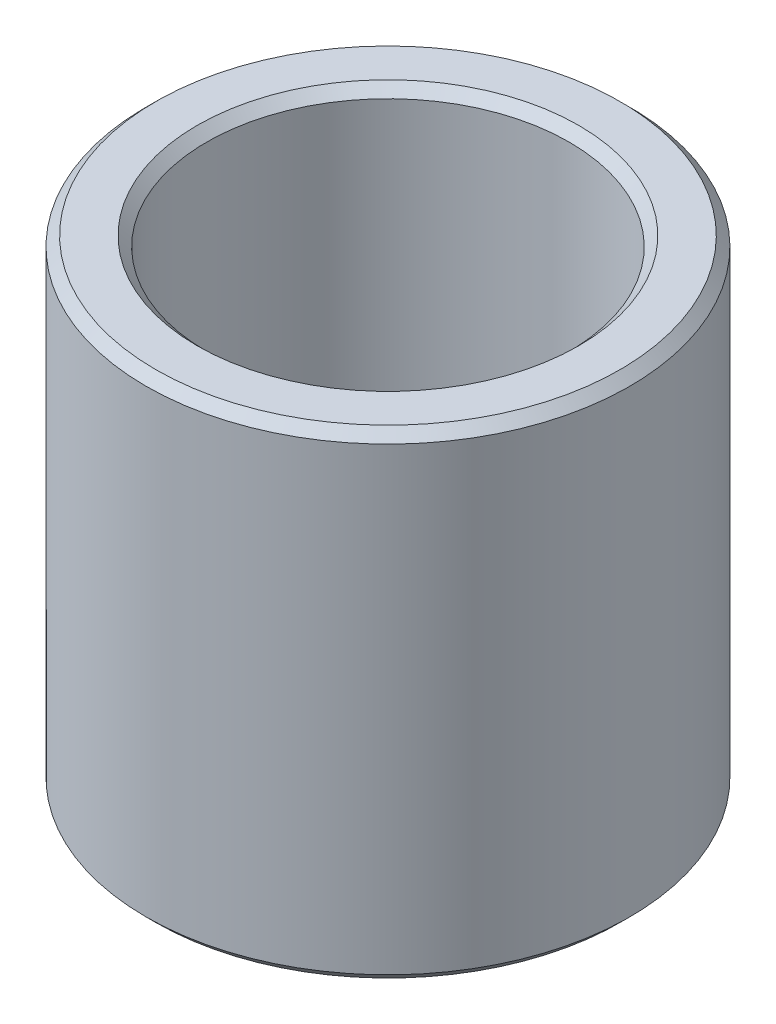
ISO-10303-21;
HEADER;
FILE_DESCRIPTION(('STEP AP214'),'2;1');
FILE_NAME('part.step','',(''),(''),'','','');
FILE_SCHEMA(('AUTOMOTIVE_DESIGN { 1 0 10303 214 1 1 1 1 }'));
ENDSEC;
DATA;
#1=APPLICATION_CONTEXT('core data for automotive mechanical design processes');
#2=APPLICATION_PROTOCOL_DEFINITION('international standard','automotive_design',2000,#1);
#3=PRODUCT_CONTEXT('',#1,'mechanical');
#4=PRODUCT('Part','Part','',(#3));
#5=PRODUCT_RELATED_PRODUCT_CATEGORY('part','',(#4));
#6=PRODUCT_DEFINITION_FORMATION('','',#4);
#7=PRODUCT_DEFINITION_CONTEXT('part definition',#1,'design');
#8=PRODUCT_DEFINITION('design','',#6,#7);
#9=PRODUCT_DEFINITION_SHAPE('','',#8);
#10=(LENGTH_UNIT() NAMED_UNIT(*) SI_UNIT(.MILLI.,.METRE.));
#11=(NAMED_UNIT(*) PLANE_ANGLE_UNIT() SI_UNIT($,.RADIAN.));
#12=(NAMED_UNIT(*) SI_UNIT($,.STERADIAN.) SOLID_ANGLE_UNIT());
#13=UNCERTAINTY_MEASURE_WITH_UNIT(LENGTH_MEASURE(1.E-05),#10,'distance_accuracy_value','');
#14=(GEOMETRIC_REPRESENTATION_CONTEXT(3) GLOBAL_UNCERTAINTY_ASSIGNED_CONTEXT((#13)) GLOBAL_UNIT_ASSIGNED_CONTEXT((#10,
#11,#12)) REPRESENTATION_CONTEXT('',''));
#15=CARTESIAN_POINT('',(0.,0.,0.));
#16=DIRECTION('',(0.,0.,1.));
#17=DIRECTION('',(1.,0.,0.));
#18=AXIS2_PLACEMENT_3D('',#15,#16,#17);
#19=CARTESIAN_POINT('',(0.,12.6492,0.));
#20=DIRECTION('',(0.,1.,0.));
#21=DIRECTION('',(0.,0.,1.));
#22=AXIS2_PLACEMENT_3D('',#19,#20,#21);
#23=PLANE('',#22);
#24=CARTESIAN_POINT('',(0.,12.6492,0.));
#25=DIRECTION('',(0.,1.,0.));
#26=DIRECTION('',(0.,0.,1.));
#27=AXIS2_PLACEMENT_3D('',#24,#25,#26);
#28=CIRCLE('',#27,6.1341);
#29=CARTESIAN_POINT('',(0.,12.6492,6.1341));
#30=VERTEX_POINT('',#29);
#31=EDGE_CURVE('E57',#30,#30,#28,.T.);
#32=ORIENTED_EDGE('',*,*,#31,.T.);
#33=EDGE_LOOP('',(#32));
#34=FACE_BOUND('',#33,.T.);
#35=CARTESIAN_POINT('',(0.,12.6492,0.));
#36=DIRECTION('',(0.,1.,0.));
#37=DIRECTION('',(0.,0.,1.));
#38=AXIS2_PLACEMENT_3D('',#35,#36,#37);
#39=CIRCLE('',#38,5.0419);
#40=CARTESIAN_POINT('',(0.,12.6492,5.0419));
#41=VERTEX_POINT('',#40);
#42=EDGE_CURVE('E60',#41,#41,#39,.F.);
#43=ORIENTED_EDGE('',*,*,#42,.T.);
#44=EDGE_LOOP('',(#43));
#45=FACE_BOUND('',#44,.T.);
#46=ADVANCED_FACE('F31',(#34,#45),#23,.T.);
#47=CARTESIAN_POINT('',(0.,0.,0.));
#48=DIRECTION('',(0.,1.,0.));
#49=DIRECTION('',(0.,0.,1.));
#50=AXIS2_PLACEMENT_3D('',#47,#48,#49);
#51=PLANE('',#50);
#52=CARTESIAN_POINT('',(0.,0.,0.));
#53=DIRECTION('',(0.,1.,0.));
#54=DIRECTION('',(0.,0.,1.));
#55=AXIS2_PLACEMENT_3D('',#52,#53,#54);
#56=CIRCLE('',#55,6.1341);
#57=CARTESIAN_POINT('',(0.,0.,6.1341));
#58=VERTEX_POINT('',#57);
#59=EDGE_CURVE('E10',#58,#58,#56,.F.);
#60=ORIENTED_EDGE('',*,*,#59,.T.);
#61=EDGE_LOOP('',(#60));
#62=FACE_BOUND('',#61,.T.);
#63=CARTESIAN_POINT('',(0.,0.,0.));
#64=DIRECTION('',(0.,1.,0.));
#65=DIRECTION('',(0.,0.,1.));
#66=AXIS2_PLACEMENT_3D('',#63,#64,#65);
#67=CIRCLE('',#66,5.0419);
#68=CARTESIAN_POINT('',(0.,0.,5.0419));
#69=VERTEX_POINT('',#68);
#70=EDGE_CURVE('E38',#69,#69,#67,.T.);
#71=ORIENTED_EDGE('',*,*,#70,.T.);
#72=EDGE_LOOP('',(#71));
#73=FACE_BOUND('',#72,.T.);
#74=ADVANCED_FACE('F87',(#62,#73),#51,.F.);
#75=CARTESIAN_POINT('',(0.,12.6492,0.));
#76=DIRECTION('',(0.,-1.,0.));
#77=DIRECTION('',(0.,0.,-1.));
#78=AXIS2_PLACEMENT_3D('',#75,#76,#77);
#79=CYLINDRICAL_SURFACE('',#78,6.3881);
#80=CARTESIAN_POINT('',(0.,12.3952,0.));
#81=DIRECTION('',(0.,1.,0.));
#82=DIRECTION('',(0.,0.,1.));
#83=AXIS2_PLACEMENT_3D('',#80,#81,#82);
#84=CIRCLE('',#83,6.3881);
#85=CARTESIAN_POINT('',(0.,12.3952,6.3881));
#86=VERTEX_POINT('',#85);
#87=EDGE_CURVE('E51',#86,#86,#84,.F.);
#88=ORIENTED_EDGE('',*,*,#87,.T.);
#89=EDGE_LOOP('',(#88));
#90=FACE_BOUND('',#89,.T.);
#91=CARTESIAN_POINT('',(0.,0.254000000000001,0.));
#92=DIRECTION('',(0.,1.,0.));
#93=DIRECTION('',(0.,0.,1.));
#94=AXIS2_PLACEMENT_3D('',#91,#92,#93);
#95=CIRCLE('',#94,6.3881);
#96=CARTESIAN_POINT('',(0.,0.254000000000001,6.3881));
#97=VERTEX_POINT('',#96);
#98=EDGE_CURVE('E54',#97,#97,#95,.T.);
#99=ORIENTED_EDGE('',*,*,#98,.T.);
#100=EDGE_LOOP('',(#99));
#101=FACE_BOUND('',#100,.T.);
#102=ADVANCED_FACE('F76',(#90,#101),#79,.T.);
#103=CARTESIAN_POINT('',(0.,12.6492,0.));
#104=DIRECTION('',(0.,-1.,0.));
#105=DIRECTION('',(0.,0.,-1.));
#106=AXIS2_PLACEMENT_3D('',#103,#104,#105);
#107=CYLINDRICAL_SURFACE('',#106,4.7879);
#108=CARTESIAN_POINT('',(0.,12.3952,0.));
#109=DIRECTION('',(0.,1.,0.));
#110=DIRECTION('',(0.,0.,1.));
#111=AXIS2_PLACEMENT_3D('',#108,#109,#110);
#112=CIRCLE('',#111,4.7879);
#113=CARTESIAN_POINT('',(0.,12.3952,4.7879));
#114=VERTEX_POINT('',#113);
#115=EDGE_CURVE('E42',#114,#114,#112,.T.);
#116=ORIENTED_EDGE('',*,*,#115,.T.);
#117=EDGE_LOOP('',(#116));
#118=FACE_BOUND('',#117,.T.);
#119=CARTESIAN_POINT('',(0.,0.254000000000004,0.));
#120=DIRECTION('',(0.,1.,0.));
#121=DIRECTION('',(0.,0.,1.));
#122=AXIS2_PLACEMENT_3D('',#119,#120,#121);
#123=CIRCLE('',#122,4.7879);
#124=CARTESIAN_POINT('',(0.,0.254000000000004,4.7879));
#125=VERTEX_POINT('',#124);
#126=EDGE_CURVE('E46',#125,#125,#123,.F.);
#127=ORIENTED_EDGE('',*,*,#126,.T.);
#128=EDGE_LOOP('',(#127));
#129=FACE_BOUND('',#128,.T.);
#130=ADVANCED_FACE('F73',(#118,#129),#107,.F.);
#131=CARTESIAN_POINT('',(0.,12.6492,0.));
#132=DIRECTION('',(0.,-1.,0.));
#133=DIRECTION('',(0.,0.,-1.));
#134=AXIS2_PLACEMENT_3D('',#131,#132,#133);
#135=CONICAL_SURFACE('',#134,6.1341,0.785398163397447);
#136=ORIENTED_EDGE('',*,*,#87,.F.);
#137=EDGE_LOOP('',(#136));
#138=FACE_BOUND('',#137,.T.);
#139=ORIENTED_EDGE('',*,*,#31,.F.);
#140=EDGE_LOOP('',(#139));
#141=FACE_BOUND('',#140,.T.);
#142=ADVANCED_FACE('F69',(#138,#141),#135,.T.);
#143=CARTESIAN_POINT('',(0.,12.3952,0.));
#144=DIRECTION('',(0.,1.,0.));
#145=DIRECTION('',(0.,0.,1.));
#146=AXIS2_PLACEMENT_3D('',#143,#144,#145);
#147=CONICAL_SURFACE('',#146,4.7879,0.785398163397459);
#148=ORIENTED_EDGE('',*,*,#42,.F.);
#149=EDGE_LOOP('',(#148));
#150=FACE_BOUND('',#149,.T.);
#151=ORIENTED_EDGE('',*,*,#115,.F.);
#152=EDGE_LOOP('',(#151));
#153=FACE_BOUND('',#152,.T.);
#154=ADVANCED_FACE('F65',(#150,#153),#147,.F.);
#155=CARTESIAN_POINT('',(0.,0.254000000000001,0.));
#156=DIRECTION('',(0.,1.,0.));
#157=DIRECTION('',(0.,0.,1.));
#158=AXIS2_PLACEMENT_3D('',#155,#156,#157);
#159=CONICAL_SURFACE('',#158,6.3881,0.78539816339745);
#160=ORIENTED_EDGE('',*,*,#59,.F.);
#161=EDGE_LOOP('',(#160));
#162=FACE_BOUND('',#161,.T.);
#163=ORIENTED_EDGE('',*,*,#98,.F.);
#164=EDGE_LOOP('',(#163));
#165=FACE_BOUND('',#164,.T.);
#166=ADVANCED_FACE('F68',(#162,#165),#159,.T.);
#167=CARTESIAN_POINT('',(0.,0.,0.));
#168=DIRECTION('',(0.,-1.,0.));
#169=DIRECTION('',(0.,0.,-1.));
#170=AXIS2_PLACEMENT_3D('',#167,#168,#169);
#171=CONICAL_SURFACE('',#170,5.0419,0.785398163397442);
#172=ORIENTED_EDGE('',*,*,#126,.F.);
#173=EDGE_LOOP('',(#172));
#174=FACE_BOUND('',#173,.T.);
#175=ORIENTED_EDGE('',*,*,#70,.F.);
#176=EDGE_LOOP('',(#175));
#177=FACE_BOUND('',#176,.T.);
#178=ADVANCED_FACE('F33',(#174,#177),#171,.F.);
#179=CLOSED_SHELL('',(#46,#74,#102,#130,#142,#154,#166,#178));
#180=MANIFOLD_SOLID_BREP('B2',#179);
#181=ADVANCED_BREP_SHAPE_REPRESENTATION('',(#18,#180),#14);
#182=SHAPE_DEFINITION_REPRESENTATION(#9,#181);
ENDSEC;
END-ISO-10303-21;
